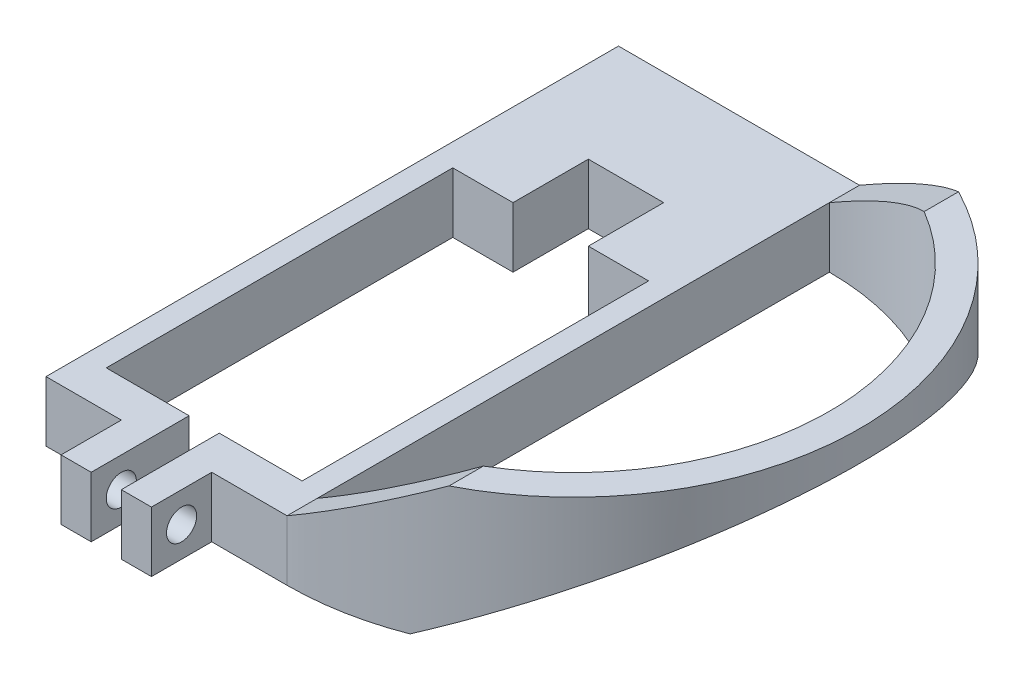
ISO-10303-21;
HEADER;
FILE_DESCRIPTION(('STEP AP214'),'2;1');
FILE_NAME('part.step','',(''),(''),'','','');
FILE_SCHEMA(('AUTOMOTIVE_DESIGN { 1 0 10303 214 1 1 1 1 }'));
ENDSEC;
DATA;
#1=APPLICATION_CONTEXT('core data for automotive mechanical design processes');
#2=APPLICATION_PROTOCOL_DEFINITION('international standard','automotive_design',2000,#1);
#3=PRODUCT_CONTEXT('',#1,'mechanical');
#4=PRODUCT('Part','Part','',(#3));
#5=PRODUCT_RELATED_PRODUCT_CATEGORY('part','',(#4));
#6=PRODUCT_DEFINITION_FORMATION('','',#4);
#7=PRODUCT_DEFINITION_CONTEXT('part definition',#1,'design');
#8=PRODUCT_DEFINITION('design','',#6,#7);
#9=PRODUCT_DEFINITION_SHAPE('','',#8);
#10=(LENGTH_UNIT() NAMED_UNIT(*) SI_UNIT(.MILLI.,.METRE.));
#11=(NAMED_UNIT(*) PLANE_ANGLE_UNIT() SI_UNIT($,.RADIAN.));
#12=(NAMED_UNIT(*) SI_UNIT($,.STERADIAN.) SOLID_ANGLE_UNIT());
#13=UNCERTAINTY_MEASURE_WITH_UNIT(LENGTH_MEASURE(1.E-05),#10,'distance_accuracy_value','');
#14=(GEOMETRIC_REPRESENTATION_CONTEXT(3) GLOBAL_UNCERTAINTY_ASSIGNED_CONTEXT((#13)) GLOBAL_UNIT_ASSIGNED_CONTEXT((#10,
#11,#12)) REPRESENTATION_CONTEXT('',''));
#15=CARTESIAN_POINT('',(0.,0.,0.));
#16=DIRECTION('',(0.,0.,1.));
#17=DIRECTION('',(1.,0.,0.));
#18=AXIS2_PLACEMENT_3D('',#15,#16,#17);
#19=CARTESIAN_POINT('',(1.,-0.00100000000000013,16.5));
#20=DIRECTION('',(1.,0.,0.));
#21=DIRECTION('',(0.,0.,-1.));
#22=AXIS2_PLACEMENT_3D('',#19,#20,#21);
#23=PLANE('',#22);
#24=DIRECTION('',(0.,0.,-1.));
#25=VECTOR('',#24,1.);
#26=CARTESIAN_POINT('',(1.,0.,16.5));
#27=LINE('',#26,#25);
#28=CARTESIAN_POINT('',(1.,0.,23.));
#29=VERTEX_POINT('',#28);
#30=CARTESIAN_POINT('',(0.999999999999998,0.,16.5));
#31=VERTEX_POINT('',#30);
#32=EDGE_CURVE('E384',#29,#31,#27,.T.);
#33=ORIENTED_EDGE('',*,*,#32,.F.);
#34=DIRECTION('',(0.,-1.,0.));
#35=VECTOR('',#34,1.);
#36=CARTESIAN_POINT('',(1.,8.47213595499958,23.));
#37=LINE('',#36,#35);
#38=CARTESIAN_POINT('',(1.,4.,23.));
#39=VERTEX_POINT('',#38);
#40=EDGE_CURVE('E758',#39,#29,#37,.T.);
#41=ORIENTED_EDGE('',*,*,#40,.F.);
#42=DIRECTION('',(0.,0.,-1.));
#43=VECTOR('',#42,1.);
#44=CARTESIAN_POINT('',(1.,4.,16.5));
#45=LINE('',#44,#43);
#46=CARTESIAN_POINT('',(0.999999999999998,4.,16.5));
#47=VERTEX_POINT('',#46);
#48=EDGE_CURVE('E391',#39,#47,#45,.T.);
#49=ORIENTED_EDGE('',*,*,#48,.T.);
#50=DIRECTION('',(0.,1.,0.));
#51=VECTOR('',#50,1.);
#52=CARTESIAN_POINT('',(1.,-0.00100000000000013,16.5));
#53=LINE('',#52,#51);
#54=EDGE_CURVE('E393',#31,#47,#53,.T.);
#55=ORIENTED_EDGE('',*,*,#54,.F.);
#56=EDGE_LOOP('',(#33,#41,#49,#55));
#57=FACE_BOUND('',#56,.T.);
#58=CARTESIAN_POINT('',(1.,2.,21.));
#59=DIRECTION('',(1.,0.,0.));
#60=DIRECTION('',(0.,0.,-1.));
#61=AXIS2_PLACEMENT_3D('',#58,#59,#60);
#62=CIRCLE('',#61,1.);
#63=CARTESIAN_POINT('',(1.,2.,20.));
#64=VERTEX_POINT('',#63);
#65=EDGE_CURVE('E778',#64,#64,#62,.T.);
#66=ORIENTED_EDGE('',*,*,#65,.T.);
#67=EDGE_LOOP('',(#66));
#68=FACE_BOUND('',#67,.T.);
#69=ADVANCED_FACE('F35',(#57,#68),#23,.F.);
#70=CARTESIAN_POINT('',(3.,8.47213595499958,19.));
#71=DIRECTION('',(-1.,0.,0.));
#72=DIRECTION('',(0.,0.,1.));
#73=AXIS2_PLACEMENT_3D('',#70,#71,#72);
#74=PLANE('',#73);
#75=DIRECTION('',(0.,-1.,0.));
#76=VECTOR('',#75,1.);
#77=CARTESIAN_POINT('',(3.,8.47213595499958,19.));
#78=LINE('',#77,#76);
#79=CARTESIAN_POINT('',(3.,4.,19.));
#80=VERTEX_POINT('',#79);
#81=CARTESIAN_POINT('',(3.,0.,19.));
#82=VERTEX_POINT('',#81);
#83=EDGE_CURVE('E212',#80,#82,#78,.T.);
#84=ORIENTED_EDGE('',*,*,#83,.F.);
#85=DIRECTION('',(0.,0.,1.));
#86=VECTOR('',#85,1.);
#87=CARTESIAN_POINT('',(3.,4.,19.));
#88=LINE('',#87,#86);
#89=CARTESIAN_POINT('',(3.,4.,23.));
#90=VERTEX_POINT('',#89);
#91=EDGE_CURVE('E759',#80,#90,#88,.T.);
#92=ORIENTED_EDGE('',*,*,#91,.T.);
#93=DIRECTION('',(0.,-1.,0.));
#94=VECTOR('',#93,1.);
#95=CARTESIAN_POINT('',(3.,8.47213595499958,23.));
#96=LINE('',#95,#94);
#97=CARTESIAN_POINT('',(3.,0.,23.));
#98=VERTEX_POINT('',#97);
#99=EDGE_CURVE('E215',#90,#98,#96,.T.);
#100=ORIENTED_EDGE('',*,*,#99,.T.);
#101=DIRECTION('',(0.,0.,-1.));
#102=VECTOR('',#101,1.);
#103=CARTESIAN_POINT('',(3.,0.,19.));
#104=LINE('',#103,#102);
#105=EDGE_CURVE('E207',#98,#82,#104,.T.);
#106=ORIENTED_EDGE('',*,*,#105,.T.);
#107=EDGE_LOOP('',(#84,#92,#100,#106));
#108=FACE_BOUND('',#107,.T.);
#109=CARTESIAN_POINT('',(3.,2.,21.));
#110=DIRECTION('',(-1.,0.,0.));
#111=DIRECTION('',(0.,0.,1.));
#112=AXIS2_PLACEMENT_3D('',#109,#110,#111);
#113=CIRCLE('',#112,1.);
#114=CARTESIAN_POINT('',(3.,2.,22.));
#115=VERTEX_POINT('',#114);
#116=EDGE_CURVE('E221',#115,#115,#113,.T.);
#117=ORIENTED_EDGE('',*,*,#116,.T.);
#118=EDGE_LOOP('',(#117));
#119=FACE_BOUND('',#118,.T.);
#120=ADVANCED_FACE('F209',(#108,#119),#74,.F.);
#121=CARTESIAN_POINT('',(-8.,4.,19.));
#122=DIRECTION('',(0.,0.,-1.));
#123=DIRECTION('',(-1.,0.,0.));
#124=AXIS2_PLACEMENT_3D('',#121,#122,#123);
#125=PLANE('',#124);
#126=ORIENTED_EDGE('',*,*,#83,.T.);
#127=DIRECTION('',(1.,0.,0.));
#128=VECTOR('',#127,1.);
#129=CARTESIAN_POINT('',(-8.,0.,19.));
#130=LINE('',#129,#128);
#131=CARTESIAN_POINT('',(8.,0.,19.));
#132=VERTEX_POINT('',#131);
#133=EDGE_CURVE('E226',#82,#132,#130,.T.);
#134=ORIENTED_EDGE('',*,*,#133,.T.);
#135=DIRECTION('',(0.,-1.,0.));
#136=VECTOR('',#135,1.);
#137=CARTESIAN_POINT('',(8.,4.,19.));
#138=LINE('',#137,#136);
#139=CARTESIAN_POINT('',(8.,4.,19.));
#140=VERTEX_POINT('',#139);
#141=EDGE_CURVE('E242',#140,#132,#138,.T.);
#142=ORIENTED_EDGE('',*,*,#141,.F.);
#143=DIRECTION('',(1.,0.,0.));
#144=VECTOR('',#143,1.);
#145=CARTESIAN_POINT('',(-8.,4.,19.));
#146=LINE('',#145,#144);
#147=EDGE_CURVE('E228',#80,#140,#146,.T.);
#148=ORIENTED_EDGE('',*,*,#147,.F.);
#149=EDGE_LOOP('',(#126,#134,#142,#148));
#150=FACE_BOUND('',#149,.T.);
#151=ADVANCED_FACE('F224',(#150),#125,.F.);
#152=CARTESIAN_POINT('',(-8.,0.,19.));
#153=VERTEX_POINT('',#152);
#154=CARTESIAN_POINT('',(-3.,0.,19.));
#155=VERTEX_POINT('',#154);
#156=EDGE_CURVE('E55',#153,#155,#130,.T.);
#157=ORIENTED_EDGE('',*,*,#156,.T.);
#158=DIRECTION('',(0.,-1.,0.));
#159=VECTOR('',#158,1.);
#160=CARTESIAN_POINT('',(-3.,8.47213595499958,19.));
#161=LINE('',#160,#159);
#162=CARTESIAN_POINT('',(-3.,4.,19.));
#163=VERTEX_POINT('',#162);
#164=EDGE_CURVE('E50',#163,#155,#161,.T.);
#165=ORIENTED_EDGE('',*,*,#164,.F.);
#166=CARTESIAN_POINT('',(-8.,4.,19.));
#167=VERTEX_POINT('',#166);
#168=EDGE_CURVE('E245',#167,#163,#146,.T.);
#169=ORIENTED_EDGE('',*,*,#168,.F.);
#170=DIRECTION('',(0.,-1.,0.));
#171=VECTOR('',#170,1.);
#172=CARTESIAN_POINT('',(-8.,4.,19.));
#173=LINE('',#172,#171);
#174=EDGE_CURVE('E244',#167,#153,#173,.T.);
#175=ORIENTED_EDGE('',*,*,#174,.T.);
#176=EDGE_LOOP('',(#157,#165,#169,#175));
#177=FACE_BOUND('',#176,.T.);
#178=ADVANCED_FACE('F509',(#177),#125,.F.);
#179=CARTESIAN_POINT('',(-6.5,4.,16.5));
#180=DIRECTION('',(0.,0.,-1.));
#181=DIRECTION('',(-1.,0.,0.));
#182=AXIS2_PLACEMENT_3D('',#179,#180,#181);
#183=PLANE('',#182);
#184=DIRECTION('',(0.,1.,0.));
#185=VECTOR('',#184,1.);
#186=CARTESIAN_POINT('',(-1.,-0.00100000000000013,16.5));
#187=LINE('',#186,#185);
#188=CARTESIAN_POINT('',(-1.,0.,16.5));
#189=VERTEX_POINT('',#188);
#190=CARTESIAN_POINT('',(-1.,4.,16.5));
#191=VERTEX_POINT('',#190);
#192=EDGE_CURVE('E394',#189,#191,#187,.T.);
#193=ORIENTED_EDGE('',*,*,#192,.F.);
#194=DIRECTION('',(1.,0.,0.));
#195=VECTOR('',#194,1.);
#196=CARTESIAN_POINT('',(-6.5,0.,16.5));
#197=LINE('',#196,#195);
#198=CARTESIAN_POINT('',(-6.5,0.,16.5));
#199=VERTEX_POINT('',#198);
#200=EDGE_CURVE('E310',#199,#189,#197,.T.);
#201=ORIENTED_EDGE('',*,*,#200,.F.);
#202=DIRECTION('',(0.,-1.,0.));
#203=VECTOR('',#202,1.);
#204=CARTESIAN_POINT('',(-6.5,4.,16.5));
#205=LINE('',#204,#203);
#206=CARTESIAN_POINT('',(-6.5,4.,16.5));
#207=VERTEX_POINT('',#206);
#208=EDGE_CURVE('E336',#207,#199,#205,.T.);
#209=ORIENTED_EDGE('',*,*,#208,.F.);
#210=DIRECTION('',(1.,0.,0.));
#211=VECTOR('',#210,1.);
#212=CARTESIAN_POINT('',(-6.5,4.,16.5));
#213=LINE('',#212,#211);
#214=EDGE_CURVE('E318',#207,#191,#213,.T.);
#215=ORIENTED_EDGE('',*,*,#214,.T.);
#216=EDGE_LOOP('',(#193,#201,#209,#215));
#217=FACE_BOUND('',#216,.T.);
#218=ADVANCED_FACE('F492',(#217),#183,.T.);
#219=CARTESIAN_POINT('',(-6.5,4.,-6.5));
#220=DIRECTION('',(0.,0.,1.));
#221=DIRECTION('',(1.,0.,0.));
#222=AXIS2_PLACEMENT_3D('',#219,#220,#221);
#223=PLANE('',#222);
#224=DIRECTION('',(0.,1.,0.));
#225=VECTOR('',#224,1.);
#226=CARTESIAN_POINT('',(-2.5,-0.00100000000000013,-6.5));
#227=LINE('',#226,#225);
#228=CARTESIAN_POINT('',(-2.5,0.,-6.5));
#229=VERTEX_POINT('',#228);
#230=CARTESIAN_POINT('',(-2.5,4.,-6.5));
#231=VERTEX_POINT('',#230);
#232=EDGE_CURVE('E415',#229,#231,#227,.T.);
#233=ORIENTED_EDGE('',*,*,#232,.T.);
#234=DIRECTION('',(-1.,0.,0.));
#235=VECTOR('',#234,1.);
#236=CARTESIAN_POINT('',(-6.5,4.,-6.5));
#237=LINE('',#236,#235);
#238=CARTESIAN_POINT('',(-6.5,4.,-6.5));
#239=VERTEX_POINT('',#238);
#240=EDGE_CURVE('E309',#231,#239,#237,.T.);
#241=ORIENTED_EDGE('',*,*,#240,.T.);
#242=DIRECTION('',(0.,-1.,0.));
#243=VECTOR('',#242,1.);
#244=CARTESIAN_POINT('',(-6.5,4.,-6.5));
#245=LINE('',#244,#243);
#246=CARTESIAN_POINT('',(-6.5,0.,-6.5));
#247=VERTEX_POINT('',#246);
#248=EDGE_CURVE('E338',#239,#247,#245,.T.);
#249=ORIENTED_EDGE('',*,*,#248,.T.);
#250=DIRECTION('',(-1.,0.,0.));
#251=VECTOR('',#250,1.);
#252=CARTESIAN_POINT('',(-6.5,0.,-6.5));
#253=LINE('',#252,#251);
#254=EDGE_CURVE('E324',#229,#247,#253,.T.);
#255=ORIENTED_EDGE('',*,*,#254,.F.);
#256=EDGE_LOOP('',(#233,#241,#249,#255));
#257=FACE_BOUND('',#256,.T.);
#258=ADVANCED_FACE('F501',(#257),#223,.T.);
#259=CARTESIAN_POINT('',(8.,4.,0.));
#260=DIRECTION('',(0.,-1.,0.));
#261=DIRECTION('',(0.,0.,-1.));
#262=AXIS2_PLACEMENT_3D('',#259,#260,#261);
#263=PLANE('',#262);
#264=ORIENTED_EDGE('',*,*,#168,.T.);
#265=DIRECTION('',(0.,0.,1.));
#266=VECTOR('',#265,1.);
#267=CARTESIAN_POINT('',(-3.,4.,19.));
#268=LINE('',#267,#266);
#269=CARTESIAN_POINT('',(-3.,4.,23.));
#270=VERTEX_POINT('',#269);
#271=EDGE_CURVE('E379',#163,#270,#268,.T.);
#272=ORIENTED_EDGE('',*,*,#271,.T.);
#273=DIRECTION('',(1.,0.,0.));
#274=VECTOR('',#273,1.);
#275=CARTESIAN_POINT('',(-1.,4.,23.));
#276=LINE('',#275,#274);
#277=CARTESIAN_POINT('',(-1.,4.,23.));
#278=VERTEX_POINT('',#277);
#279=EDGE_CURVE('E381',#270,#278,#276,.T.);
#280=ORIENTED_EDGE('',*,*,#279,.T.);
#281=DIRECTION('',(0.,0.,1.));
#282=VECTOR('',#281,1.);
#283=CARTESIAN_POINT('',(-1.,4.,16.5));
#284=LINE('',#283,#282);
#285=EDGE_CURVE('E389',#191,#278,#284,.T.);
#286=ORIENTED_EDGE('',*,*,#285,.F.);
#287=ORIENTED_EDGE('',*,*,#214,.F.);
#288=DIRECTION('',(0.,0.,1.));
#289=VECTOR('',#288,1.);
#290=CARTESIAN_POINT('',(-6.5,4.,16.5));
#291=LINE('',#290,#289);
#292=EDGE_CURVE('E314',#239,#207,#291,.T.);
#293=ORIENTED_EDGE('',*,*,#292,.F.);
#294=ORIENTED_EDGE('',*,*,#240,.F.);
#295=DIRECTION('',(0.,0.,1.));
#296=VECTOR('',#295,1.);
#297=CARTESIAN_POINT('',(-2.5,4.,-6.5));
#298=LINE('',#297,#296);
#299=CARTESIAN_POINT('',(-2.5,4.,-11.5));
#300=VERTEX_POINT('',#299);
#301=EDGE_CURVE('E407',#300,#231,#298,.T.);
#302=ORIENTED_EDGE('',*,*,#301,.F.);
#303=DIRECTION('',(-1.,0.,0.));
#304=VECTOR('',#303,1.);
#305=CARTESIAN_POINT('',(-2.5,4.,-11.5));
#306=LINE('',#305,#304);
#307=CARTESIAN_POINT('',(2.5,4.,-11.5));
#308=VERTEX_POINT('',#307);
#309=EDGE_CURVE('E412',#308,#300,#306,.T.);
#310=ORIENTED_EDGE('',*,*,#309,.F.);
#311=DIRECTION('',(0.,0.,-1.));
#312=VECTOR('',#311,1.);
#313=CARTESIAN_POINT('',(2.5,4.,-6.5));
#314=LINE('',#313,#312);
#315=CARTESIAN_POINT('',(2.5,4.,-6.5));
#316=VERTEX_POINT('',#315);
#317=EDGE_CURVE('E409',#316,#308,#314,.T.);
#318=ORIENTED_EDGE('',*,*,#317,.F.);
#319=CARTESIAN_POINT('',(6.5,4.,-6.5));
#320=VERTEX_POINT('',#319);
#321=EDGE_CURVE('E311',#320,#316,#237,.T.);
#322=ORIENTED_EDGE('',*,*,#321,.F.);
#323=DIRECTION('',(0.,0.,-1.));
#324=VECTOR('',#323,1.);
#325=CARTESIAN_POINT('',(6.5,4.,16.5));
#326=LINE('',#325,#324);
#327=CARTESIAN_POINT('',(6.5,4.,16.5));
#328=VERTEX_POINT('',#327);
#329=EDGE_CURVE('E307',#328,#320,#326,.T.);
#330=ORIENTED_EDGE('',*,*,#329,.F.);
#331=EDGE_CURVE('E317',#47,#328,#213,.T.);
#332=ORIENTED_EDGE('',*,*,#331,.F.);
#333=ORIENTED_EDGE('',*,*,#48,.F.);
#334=DIRECTION('',(-1.,0.,0.));
#335=VECTOR('',#334,1.);
#336=CARTESIAN_POINT('',(1.,4.,23.));
#337=LINE('',#336,#335);
#338=EDGE_CURVE('E756',#90,#39,#337,.T.);
#339=ORIENTED_EDGE('',*,*,#338,.F.);
#340=ORIENTED_EDGE('',*,*,#91,.F.);
#341=ORIENTED_EDGE('',*,*,#147,.T.);
#342=DIRECTION('',(0.,0.,1.));
#343=VECTOR('',#342,1.);
#344=CARTESIAN_POINT('',(8.,4.,17.));
#345=LINE('',#344,#343);
#346=CARTESIAN_POINT('',(8.,4.,17.));
#347=VERTEX_POINT('',#346);
#348=EDGE_CURVE('E287',#347,#140,#345,.T.);
#349=ORIENTED_EDGE('',*,*,#348,.F.);
#350=DIRECTION('',(0.,0.,1.));
#351=VECTOR('',#350,1.);
#352=CARTESIAN_POINT('',(7.99999999999999,4.,-17.));
#353=LINE('',#352,#351);
#354=CARTESIAN_POINT('',(8.,4.,-17.));
#355=VERTEX_POINT('',#354);
#356=EDGE_CURVE('E295',#355,#347,#353,.T.);
#357=ORIENTED_EDGE('',*,*,#356,.F.);
#358=DIRECTION('',(0.,0.,1.));
#359=VECTOR('',#358,1.);
#360=CARTESIAN_POINT('',(7.99999999999999,4.,-19.));
#361=LINE('',#360,#359);
#362=CARTESIAN_POINT('',(8.,4.,-19.));
#363=VERTEX_POINT('',#362);
#364=EDGE_CURVE('E291',#363,#355,#361,.T.);
#365=ORIENTED_EDGE('',*,*,#364,.F.);
#366=DIRECTION('',(-1.,0.,0.));
#367=VECTOR('',#366,1.);
#368=CARTESIAN_POINT('',(-8.00000000000001,4.,-19.));
#369=LINE('',#368,#367);
#370=CARTESIAN_POINT('',(-8.00000000000001,4.,-19.));
#371=VERTEX_POINT('',#370);
#372=EDGE_CURVE('E237',#363,#371,#369,.T.);
#373=ORIENTED_EDGE('',*,*,#372,.T.);
#374=DIRECTION('',(0.,0.,1.));
#375=VECTOR('',#374,1.);
#376=CARTESIAN_POINT('',(-8.,4.,19.));
#377=LINE('',#376,#375);
#378=EDGE_CURVE('E346',#371,#167,#377,.T.);
#379=ORIENTED_EDGE('',*,*,#378,.T.);
#380=EDGE_LOOP('',(#264,#272,#280,#286,#287,#293,#294,#302,#310,#318,#322,#330,#332,#333,#339,
#340,#341,#349,#357,#365,#373,#379));
#381=FACE_BOUND('',#380,.T.);
#382=ADVANCED_FACE('F434',(#381),#263,.F.);
#383=CARTESIAN_POINT('',(8.,0.,0.));
#384=DIRECTION('',(0.,-1.,0.));
#385=DIRECTION('',(0.,0.,-1.));
#386=AXIS2_PLACEMENT_3D('',#383,#384,#385);
#387=PLANE('',#386);
#388=DIRECTION('',(0.,0.,1.));
#389=VECTOR('',#388,1.);
#390=CARTESIAN_POINT('',(-1.,0.,16.5));
#391=LINE('',#390,#389);
#392=CARTESIAN_POINT('',(-1.,0.,23.));
#393=VERTEX_POINT('',#392);
#394=EDGE_CURVE('E387',#189,#393,#391,.T.);
#395=ORIENTED_EDGE('',*,*,#394,.T.);
#396=DIRECTION('',(-1.,0.,0.));
#397=VECTOR('',#396,1.);
#398=CARTESIAN_POINT('',(-1.,0.,23.));
#399=LINE('',#398,#397);
#400=CARTESIAN_POINT('',(-3.,0.,23.));
#401=VERTEX_POINT('',#400);
#402=EDGE_CURVE('E366',#393,#401,#399,.T.);
#403=ORIENTED_EDGE('',*,*,#402,.T.);
#404=DIRECTION('',(0.,0.,-1.));
#405=VECTOR('',#404,1.);
#406=CARTESIAN_POINT('',(-3.,0.,19.));
#407=LINE('',#406,#405);
#408=EDGE_CURVE('E364',#401,#155,#407,.T.);
#409=ORIENTED_EDGE('',*,*,#408,.T.);
#410=ORIENTED_EDGE('',*,*,#156,.F.);
#411=DIRECTION('',(0.,0.,1.));
#412=VECTOR('',#411,1.);
#413=CARTESIAN_POINT('',(-8.,0.,19.));
#414=LINE('',#413,#412);
#415=CARTESIAN_POINT('',(-8.00000000000001,0.,-19.));
#416=VERTEX_POINT('',#415);
#417=EDGE_CURVE('E235',#416,#153,#414,.T.);
#418=ORIENTED_EDGE('',*,*,#417,.F.);
#419=DIRECTION('',(-1.,0.,0.));
#420=VECTOR('',#419,1.);
#421=CARTESIAN_POINT('',(-8.00000000000001,0.,-19.));
#422=LINE('',#421,#420);
#423=CARTESIAN_POINT('',(7.99999999999999,0.,-19.));
#424=VERTEX_POINT('',#423);
#425=EDGE_CURVE('E238',#424,#416,#422,.T.);
#426=ORIENTED_EDGE('',*,*,#425,.F.);
#427=CARTESIAN_POINT('',(8.,0.,0.));
#428=DIRECTION('',(0.,1.,0.));
#429=DIRECTION('',(0.,0.,-1.));
#430=AXIS2_PLACEMENT_3D('',#427,#428,#429);
#431=CIRCLE('',#430,19.);
#432=CARTESIAN_POINT('',(14.8756443470177,0.,-17.7122984057215));
#433=VERTEX_POINT('',#432);
#434=EDGE_CURVE('E344',#433,#424,#431,.T.);
#435=ORIENTED_EDGE('',*,*,#434,.F.);
#436=DIRECTION('',(0.,0.,1.));
#437=VECTOR('',#436,1.);
#438=CARTESIAN_POINT('',(14.8756443470177,0.,-33.0000000000001));
#439=LINE('',#438,#437);
#440=CARTESIAN_POINT('',(14.8756443470177,0.,-15.5475243950065));
#441=VERTEX_POINT('',#440);
#442=EDGE_CURVE('E426',#433,#441,#439,.T.);
#443=ORIENTED_EDGE('',*,*,#442,.T.);
#444=CARTESIAN_POINT('',(8.,0.,0.));
#445=DIRECTION('',(0.,1.,0.));
#446=DIRECTION('',(0.,0.,-1.));
#447=AXIS2_PLACEMENT_3D('',#444,#445,#446);
#448=CIRCLE('',#447,17.);
#449=CARTESIAN_POINT('',(7.99999999999999,0.,-17.));
#450=VERTEX_POINT('',#449);
#451=EDGE_CURVE('E282',#441,#450,#448,.T.);
#452=ORIENTED_EDGE('',*,*,#451,.T.);
#453=DIRECTION('',(0.,0.,1.));
#454=VECTOR('',#453,1.);
#455=CARTESIAN_POINT('',(7.99999999999999,0.,-17.));
#456=LINE('',#455,#454);
#457=CARTESIAN_POINT('',(8.,0.,17.));
#458=VERTEX_POINT('',#457);
#459=EDGE_CURVE('E297',#450,#458,#456,.T.);
#460=ORIENTED_EDGE('',*,*,#459,.T.);
#461=CARTESIAN_POINT('',(14.8756443470177,0.,15.5475243950065));
#462=VERTEX_POINT('',#461);
#463=EDGE_CURVE('E285',#458,#462,#448,.T.);
#464=ORIENTED_EDGE('',*,*,#463,.T.);
#465=CARTESIAN_POINT('',(14.8756443470177,0.,17.7122984057215));
#466=VERTEX_POINT('',#465);
#467=EDGE_CURVE('E418',#462,#466,#439,.T.);
#468=ORIENTED_EDGE('',*,*,#467,.T.);
#469=EDGE_CURVE('E234',#132,#466,#431,.T.);
#470=ORIENTED_EDGE('',*,*,#469,.F.);
#471=ORIENTED_EDGE('',*,*,#133,.F.);
#472=ORIENTED_EDGE('',*,*,#105,.F.);
#473=DIRECTION('',(1.,0.,0.));
#474=VECTOR('',#473,1.);
#475=CARTESIAN_POINT('',(1.,0.,23.));
#476=LINE('',#475,#474);
#477=EDGE_CURVE('E220',#29,#98,#476,.T.);
#478=ORIENTED_EDGE('',*,*,#477,.F.);
#479=ORIENTED_EDGE('',*,*,#32,.T.);
#480=CARTESIAN_POINT('',(6.5,0.,16.5));
#481=VERTEX_POINT('',#480);
#482=EDGE_CURVE('E331',#31,#481,#197,.T.);
#483=ORIENTED_EDGE('',*,*,#482,.T.);
#484=DIRECTION('',(0.,0.,-1.));
#485=VECTOR('',#484,1.);
#486=CARTESIAN_POINT('',(6.5,0.,16.5));
#487=LINE('',#486,#485);
#488=CARTESIAN_POINT('',(6.5,0.,-6.5));
#489=VERTEX_POINT('',#488);
#490=EDGE_CURVE('E306',#481,#489,#487,.T.);
#491=ORIENTED_EDGE('',*,*,#490,.T.);
#492=CARTESIAN_POINT('',(2.5,0.,-6.5));
#493=VERTEX_POINT('',#492);
#494=EDGE_CURVE('E325',#489,#493,#253,.T.);
#495=ORIENTED_EDGE('',*,*,#494,.T.);
#496=DIRECTION('',(0.,0.,-1.));
#497=VECTOR('',#496,1.);
#498=CARTESIAN_POINT('',(2.5,0.,-6.5));
#499=LINE('',#498,#497);
#500=CARTESIAN_POINT('',(2.5,0.,-11.5));
#501=VERTEX_POINT('',#500);
#502=EDGE_CURVE('E396',#493,#501,#499,.T.);
#503=ORIENTED_EDGE('',*,*,#502,.T.);
#504=DIRECTION('',(-1.,0.,0.));
#505=VECTOR('',#504,1.);
#506=CARTESIAN_POINT('',(-2.5,0.,-11.5));
#507=LINE('',#506,#505);
#508=CARTESIAN_POINT('',(-2.5,0.,-11.5));
#509=VERTEX_POINT('',#508);
#510=EDGE_CURVE('E401',#501,#509,#507,.T.);
#511=ORIENTED_EDGE('',*,*,#510,.T.);
#512=DIRECTION('',(0.,0.,1.));
#513=VECTOR('',#512,1.);
#514=CARTESIAN_POINT('',(-2.5,0.,-6.5));
#515=LINE('',#514,#513);
#516=EDGE_CURVE('E404',#509,#229,#515,.T.);
#517=ORIENTED_EDGE('',*,*,#516,.T.);
#518=ORIENTED_EDGE('',*,*,#254,.T.);
#519=DIRECTION('',(0.,0.,1.));
#520=VECTOR('',#519,1.);
#521=CARTESIAN_POINT('',(-6.5,0.,16.5));
#522=LINE('',#521,#520);
#523=EDGE_CURVE('E328',#247,#199,#522,.T.);
#524=ORIENTED_EDGE('',*,*,#523,.T.);
#525=ORIENTED_EDGE('',*,*,#200,.T.);
#526=EDGE_LOOP('',(#395,#403,#409,#410,#418,#426,#435,#443,#452,#460,#464,#468,#470,#471,#472,
#478,#479,#483,#491,#495,#503,#511,#517,#518,#524,#525));
#527=FACE_BOUND('',#526,.T.);
#528=ADVANCED_FACE('F231',(#527),#387,.T.);
#529=CARTESIAN_POINT('',(8.,4.,0.));
#530=DIRECTION('',(0.,-1.,0.));
#531=DIRECTION('',(0.,0.,-1.));
#532=AXIS2_PLACEMENT_3D('',#529,#530,#531);
#533=CYLINDRICAL_SURFACE('',#532,19.);
#534=ORIENTED_EDGE('',*,*,#469,.T.);
#535=CARTESIAN_POINT('',(8.,-3.96965511460274,0.));
#536=DIRECTION('',(-0.499999999999995,0.866025403784442,0.));
#537=DIRECTION('',(-0.866025403784442,-0.499999999999995,0.));
#538=AXIS2_PLACEMENT_3D('',#535,#536,#537);
#539=ELLIPSE('',#538,21.9393102292057,19.);
#540=EDGE_CURVE('E279',#466,#433,#539,.T.);
#541=ORIENTED_EDGE('',*,*,#540,.T.);
#542=ORIENTED_EDGE('',*,*,#434,.T.);
#543=DIRECTION('',(0.,-1.,0.));
#544=VECTOR('',#543,1.);
#545=CARTESIAN_POINT('',(7.99999999999999,4.,-19.));
#546=LINE('',#545,#544);
#547=EDGE_CURVE('E250',#363,#424,#546,.T.);
#548=ORIENTED_EDGE('',*,*,#547,.F.);
#549=CARTESIAN_POINT('',(8.,4.,0.));
#550=DIRECTION('',(0.499999999999995,-0.866025403784441,0.));
#551=DIRECTION('',(-0.866025403784442,-0.499999999999995,0.));
#552=AXIS2_PLACEMENT_3D('',#549,#550,#551);
#553=ELLIPSE('',#552,21.9393102292057,19.);
#554=CARTESIAN_POINT('',(16.6602540378445,9.,-16.9115345252877));
#555=VERTEX_POINT('',#554);
#556=EDGE_CURVE('E293',#363,#555,#553,.T.);
#557=ORIENTED_EDGE('',*,*,#556,.T.);
#558=CARTESIAN_POINT('',(8.,9.,0.));
#559=DIRECTION('',(0.,1.,0.));
#560=DIRECTION('',(0.,0.,1.));
#561=AXIS2_PLACEMENT_3D('',#558,#559,#560);
#562=CIRCLE('',#561,19.);
#563=CARTESIAN_POINT('',(16.6602540378445,9.,16.9115345252877));
#564=VERTEX_POINT('',#563);
#565=EDGE_CURVE('E283',#564,#555,#562,.T.);
#566=ORIENTED_EDGE('',*,*,#565,.F.);
#567=EDGE_CURVE('E264',#564,#140,#553,.T.);
#568=ORIENTED_EDGE('',*,*,#567,.T.);
#569=ORIENTED_EDGE('',*,*,#141,.T.);
#570=EDGE_LOOP('',(#534,#541,#542,#548,#557,#566,#568,#569));
#571=FACE_BOUND('',#570,.T.);
#572=ADVANCED_FACE('F37',(#571),#533,.T.);
#573=CARTESIAN_POINT('',(-8.00000000000001,4.,-19.));
#574=DIRECTION('',(0.,0.,1.));
#575=DIRECTION('',(1.,0.,0.));
#576=AXIS2_PLACEMENT_3D('',#573,#574,#575);
#577=PLANE('',#576);
#578=ORIENTED_EDGE('',*,*,#425,.T.);
#579=DIRECTION('',(0.,-1.,0.));
#580=VECTOR('',#579,1.);
#581=CARTESIAN_POINT('',(-8.00000000000001,4.,-19.));
#582=LINE('',#581,#580);
#583=EDGE_CURVE('E247',#371,#416,#582,.T.);
#584=ORIENTED_EDGE('',*,*,#583,.F.);
#585=ORIENTED_EDGE('',*,*,#372,.F.);
#586=ORIENTED_EDGE('',*,*,#547,.T.);
#587=EDGE_LOOP('',(#578,#584,#585,#586));
#588=FACE_BOUND('',#587,.T.);
#589=ADVANCED_FACE('F352',(#588),#577,.F.);
#590=CARTESIAN_POINT('',(-8.,4.,19.));
#591=DIRECTION('',(1.,0.,0.));
#592=DIRECTION('',(0.,0.,-1.));
#593=AXIS2_PLACEMENT_3D('',#590,#591,#592);
#594=PLANE('',#593);
#595=ORIENTED_EDGE('',*,*,#417,.T.);
#596=ORIENTED_EDGE('',*,*,#174,.F.);
#597=ORIENTED_EDGE('',*,*,#378,.F.);
#598=ORIENTED_EDGE('',*,*,#583,.T.);
#599=EDGE_LOOP('',(#595,#596,#597,#598));
#600=FACE_BOUND('',#599,.T.);
#601=ADVANCED_FACE('F359',(#600),#594,.F.);
#602=CARTESIAN_POINT('',(6.5,4.,16.5));
#603=DIRECTION('',(-1.,0.,0.));
#604=DIRECTION('',(0.,0.,1.));
#605=AXIS2_PLACEMENT_3D('',#602,#603,#604);
#606=PLANE('',#605);
#607=ORIENTED_EDGE('',*,*,#490,.F.);
#608=DIRECTION('',(0.,-1.,0.));
#609=VECTOR('',#608,1.);
#610=CARTESIAN_POINT('',(6.5,4.,16.5));
#611=LINE('',#610,#609);
#612=EDGE_CURVE('E321',#328,#481,#611,.T.);
#613=ORIENTED_EDGE('',*,*,#612,.F.);
#614=ORIENTED_EDGE('',*,*,#329,.T.);
#615=DIRECTION('',(0.,-1.,0.));
#616=VECTOR('',#615,1.);
#617=CARTESIAN_POINT('',(6.5,4.,-6.5));
#618=LINE('',#617,#616);
#619=EDGE_CURVE('E341',#320,#489,#618,.T.);
#620=ORIENTED_EDGE('',*,*,#619,.T.);
#621=EDGE_LOOP('',(#607,#613,#614,#620));
#622=FACE_BOUND('',#621,.T.);
#623=ADVANCED_FACE('F499',(#622),#606,.T.);
#624=DIRECTION('',(0.,1.,0.));
#625=VECTOR('',#624,1.);
#626=CARTESIAN_POINT('',(2.5,-0.00100000000000013,-6.5));
#627=LINE('',#626,#625);
#628=EDGE_CURVE('E421',#493,#316,#627,.T.);
#629=ORIENTED_EDGE('',*,*,#628,.F.);
#630=ORIENTED_EDGE('',*,*,#494,.F.);
#631=ORIENTED_EDGE('',*,*,#619,.F.);
#632=ORIENTED_EDGE('',*,*,#321,.T.);
#633=EDGE_LOOP('',(#629,#630,#631,#632));
#634=FACE_BOUND('',#633,.T.);
#635=ADVANCED_FACE('F495',(#634),#223,.T.);
#636=CARTESIAN_POINT('',(-6.5,4.,16.5));
#637=DIRECTION('',(1.,0.,0.));
#638=DIRECTION('',(0.,0.,-1.));
#639=AXIS2_PLACEMENT_3D('',#636,#637,#638);
#640=PLANE('',#639);
#641=ORIENTED_EDGE('',*,*,#523,.F.);
#642=ORIENTED_EDGE('',*,*,#248,.F.);
#643=ORIENTED_EDGE('',*,*,#292,.T.);
#644=ORIENTED_EDGE('',*,*,#208,.T.);
#645=EDGE_LOOP('',(#641,#642,#643,#644));
#646=FACE_BOUND('',#645,.T.);
#647=ADVANCED_FACE('F490',(#646),#640,.T.);
#648=ORIENTED_EDGE('',*,*,#54,.T.);
#649=ORIENTED_EDGE('',*,*,#331,.T.);
#650=ORIENTED_EDGE('',*,*,#612,.T.);
#651=ORIENTED_EDGE('',*,*,#482,.F.);
#652=EDGE_LOOP('',(#648,#649,#650,#651));
#653=FACE_BOUND('',#652,.T.);
#654=ADVANCED_FACE('F487',(#653),#183,.T.);
#655=CARTESIAN_POINT('',(8.,4.,0.));
#656=DIRECTION('',(0.,-1.,0.));
#657=DIRECTION('',(0.,0.,-1.));
#658=AXIS2_PLACEMENT_3D('',#655,#656,#657);
#659=CYLINDRICAL_SURFACE('',#658,17.);
#660=CARTESIAN_POINT('',(8.,-3.96965511460274,0.));
#661=DIRECTION('',(-0.499999999999995,0.866025403784442,0.));
#662=DIRECTION('',(-0.866025403784442,-0.499999999999995,0.));
#663=AXIS2_PLACEMENT_3D('',#660,#661,#662);
#664=ELLIPSE('',#663,19.6299091524472,17.);
#665=EDGE_CURVE('E11',#462,#441,#664,.T.);
#666=ORIENTED_EDGE('',*,*,#665,.F.);
#667=ORIENTED_EDGE('',*,*,#463,.F.);
#668=DIRECTION('',(0.,-1.,0.));
#669=VECTOR('',#668,1.);
#670=CARTESIAN_POINT('',(8.,4.,17.));
#671=LINE('',#670,#669);
#672=EDGE_CURVE('E277',#347,#458,#671,.T.);
#673=ORIENTED_EDGE('',*,*,#672,.F.);
#674=CARTESIAN_POINT('',(8.,4.,0.));
#675=DIRECTION('',(0.499999999999995,-0.866025403784441,0.));
#676=DIRECTION('',(-0.866025403784442,-0.499999999999995,0.));
#677=AXIS2_PLACEMENT_3D('',#674,#675,#676);
#678=ELLIPSE('',#677,19.6299091524472,17.);
#679=CARTESIAN_POINT('',(16.6602540378445,9.,14.6287388383277));
#680=VERTEX_POINT('',#679);
#681=EDGE_CURVE('E261',#680,#347,#678,.T.);
#682=ORIENTED_EDGE('',*,*,#681,.F.);
#683=CARTESIAN_POINT('',(8.,9.,0.));
#684=DIRECTION('',(0.,-1.,0.));
#685=DIRECTION('',(0.,0.,1.));
#686=AXIS2_PLACEMENT_3D('',#683,#684,#685);
#687=CIRCLE('',#686,17.);
#688=CARTESIAN_POINT('',(16.6602540378445,9.,-14.6287388383277));
#689=VERTEX_POINT('',#688);
#690=EDGE_CURVE('E275',#689,#680,#687,.T.);
#691=ORIENTED_EDGE('',*,*,#690,.F.);
#692=EDGE_CURVE('E278',#355,#689,#678,.T.);
#693=ORIENTED_EDGE('',*,*,#692,.F.);
#694=DIRECTION('',(0.,-1.,0.));
#695=VECTOR('',#694,1.);
#696=CARTESIAN_POINT('',(7.99999999999999,4.,-17.));
#697=LINE('',#696,#695);
#698=EDGE_CURVE('E303',#355,#450,#697,.T.);
#699=ORIENTED_EDGE('',*,*,#698,.T.);
#700=ORIENTED_EDGE('',*,*,#451,.F.);
#701=EDGE_LOOP('',(#666,#667,#673,#682,#691,#693,#699,#700));
#702=FACE_BOUND('',#701,.T.);
#703=ADVANCED_FACE('F273',(#702),#659,.F.);
#704=CARTESIAN_POINT('',(7.99999999999999,4.,-17.));
#705=DIRECTION('',(1.,0.,0.));
#706=DIRECTION('',(0.,0.,-1.));
#707=AXIS2_PLACEMENT_3D('',#704,#705,#706);
#708=PLANE('',#707);
#709=ORIENTED_EDGE('',*,*,#459,.F.);
#710=ORIENTED_EDGE('',*,*,#698,.F.);
#711=ORIENTED_EDGE('',*,*,#356,.T.);
#712=ORIENTED_EDGE('',*,*,#672,.T.);
#713=EDGE_LOOP('',(#709,#710,#711,#712));
#714=FACE_BOUND('',#713,.T.);
#715=ADVANCED_FACE('F437',(#714),#708,.T.);
#716=CARTESIAN_POINT('',(8.,9.,0.));
#717=DIRECTION('',(0.,1.,0.));
#718=DIRECTION('',(0.,0.,1.));
#719=AXIS2_PLACEMENT_3D('',#716,#717,#718);
#720=PLANE('',#719);
#721=DIRECTION('',(0.,0.,-1.));
#722=VECTOR('',#721,1.);
#723=CARTESIAN_POINT('',(16.6602540378445,9.,0.));
#724=LINE('',#723,#722);
#725=EDGE_CURVE('E43',#564,#680,#724,.T.);
#726=ORIENTED_EDGE('',*,*,#725,.F.);
#727=ORIENTED_EDGE('',*,*,#565,.T.);
#728=EDGE_CURVE('E252',#689,#555,#724,.T.);
#729=ORIENTED_EDGE('',*,*,#728,.F.);
#730=ORIENTED_EDGE('',*,*,#690,.T.);
#731=EDGE_LOOP('',(#726,#727,#729,#730));
#732=FACE_BOUND('',#731,.T.);
#733=ADVANCED_FACE('F281',(#732),#720,.T.);
#734=CARTESIAN_POINT('',(16.6602540378445,9.,-33.0000000000001));
#735=DIRECTION('',(0.499999999999995,-0.866025403784441,0.));
#736=DIRECTION('',(0.866025403784442,0.499999999999995,0.));
#737=AXIS2_PLACEMENT_3D('',#734,#735,#736);
#738=PLANE('',#737);
#739=ORIENTED_EDGE('',*,*,#364,.T.);
#740=ORIENTED_EDGE('',*,*,#692,.T.);
#741=ORIENTED_EDGE('',*,*,#728,.T.);
#742=ORIENTED_EDGE('',*,*,#556,.F.);
#743=EDGE_LOOP('',(#739,#740,#741,#742));
#744=FACE_BOUND('',#743,.T.);
#745=ADVANCED_FACE('F428',(#744),#738,.F.);
#746=ORIENTED_EDGE('',*,*,#725,.T.);
#747=ORIENTED_EDGE('',*,*,#681,.T.);
#748=ORIENTED_EDGE('',*,*,#348,.T.);
#749=ORIENTED_EDGE('',*,*,#567,.F.);
#750=EDGE_LOOP('',(#746,#747,#748,#749));
#751=FACE_BOUND('',#750,.T.);
#752=ADVANCED_FACE('F259',(#751),#738,.F.);
#753=CARTESIAN_POINT('',(27.,7.,-33.0000000000001));
#754=DIRECTION('',(-0.499999999999995,0.866025403784442,0.));
#755=DIRECTION('',(-0.866025403784442,-0.499999999999995,0.));
#756=AXIS2_PLACEMENT_3D('',#753,#754,#755);
#757=PLANE('',#756);
#758=ORIENTED_EDGE('',*,*,#467,.F.);
#759=ORIENTED_EDGE('',*,*,#665,.T.);
#760=ORIENTED_EDGE('',*,*,#442,.F.);
#761=ORIENTED_EDGE('',*,*,#540,.F.);
#762=EDGE_LOOP('',(#758,#759,#760,#761));
#763=FACE_BOUND('',#762,.T.);
#764=ADVANCED_FACE('F441',(#763),#757,.F.);
#765=CARTESIAN_POINT('',(-2.5,-0.00100000000000013,-6.5));
#766=DIRECTION('',(-1.,0.,0.));
#767=DIRECTION('',(0.,0.,1.));
#768=AXIS2_PLACEMENT_3D('',#765,#766,#767);
#769=PLANE('',#768);
#770=DIRECTION('',(0.,1.,0.));
#771=VECTOR('',#770,1.);
#772=CARTESIAN_POINT('',(-2.5,-0.00100000000000013,-11.5));
#773=LINE('',#772,#771);
#774=EDGE_CURVE('E416',#509,#300,#773,.T.);
#775=ORIENTED_EDGE('',*,*,#774,.T.);
#776=ORIENTED_EDGE('',*,*,#301,.T.);
#777=ORIENTED_EDGE('',*,*,#232,.F.);
#778=ORIENTED_EDGE('',*,*,#516,.F.);
#779=EDGE_LOOP('',(#775,#776,#777,#778));
#780=FACE_BOUND('',#779,.T.);
#781=ADVANCED_FACE('F469',(#780),#769,.F.);
#782=CARTESIAN_POINT('',(-2.5,-0.00100000000000013,-11.5));
#783=DIRECTION('',(0.,0.,-1.));
#784=DIRECTION('',(-1.,0.,0.));
#785=AXIS2_PLACEMENT_3D('',#782,#783,#784);
#786=PLANE('',#785);
#787=DIRECTION('',(0.,1.,0.));
#788=VECTOR('',#787,1.);
#789=CARTESIAN_POINT('',(2.5,-0.00100000000000013,-11.5));
#790=LINE('',#789,#788);
#791=EDGE_CURVE('E419',#501,#308,#790,.T.);
#792=ORIENTED_EDGE('',*,*,#791,.T.);
#793=ORIENTED_EDGE('',*,*,#309,.T.);
#794=ORIENTED_EDGE('',*,*,#774,.F.);
#795=ORIENTED_EDGE('',*,*,#510,.F.);
#796=EDGE_LOOP('',(#792,#793,#794,#795));
#797=FACE_BOUND('',#796,.T.);
#798=ADVANCED_FACE('F466',(#797),#786,.F.);
#799=CARTESIAN_POINT('',(2.5,-0.00100000000000013,-6.5));
#800=DIRECTION('',(1.,0.,0.));
#801=DIRECTION('',(0.,0.,-1.));
#802=AXIS2_PLACEMENT_3D('',#799,#800,#801);
#803=PLANE('',#802);
#804=ORIENTED_EDGE('',*,*,#628,.T.);
#805=ORIENTED_EDGE('',*,*,#317,.T.);
#806=ORIENTED_EDGE('',*,*,#791,.F.);
#807=ORIENTED_EDGE('',*,*,#502,.F.);
#808=EDGE_LOOP('',(#804,#805,#806,#807));
#809=FACE_BOUND('',#808,.T.);
#810=ADVANCED_FACE('F464',(#809),#803,.F.);
#811=CARTESIAN_POINT('',(-1.,-0.00100000000000013,16.5));
#812=DIRECTION('',(-1.,0.,0.));
#813=DIRECTION('',(0.,0.,1.));
#814=AXIS2_PLACEMENT_3D('',#811,#812,#813);
#815=PLANE('',#814);
#816=CARTESIAN_POINT('',(-1.,2.,21.));
#817=DIRECTION('',(-1.,0.,0.));
#818=DIRECTION('',(0.,0.,1.));
#819=AXIS2_PLACEMENT_3D('',#816,#817,#818);
#820=CIRCLE('',#819,1.);
#821=CARTESIAN_POINT('',(-0.999999999999997,2.,22.));
#822=VERTEX_POINT('',#821);
#823=EDGE_CURVE('E374',#822,#822,#820,.F.);
#824=ORIENTED_EDGE('',*,*,#823,.F.);
#825=EDGE_LOOP('',(#824));
#826=FACE_BOUND('',#825,.T.);
#827=ORIENTED_EDGE('',*,*,#192,.T.);
#828=ORIENTED_EDGE('',*,*,#285,.T.);
#829=DIRECTION('',(0.,-1.,0.));
#830=VECTOR('',#829,1.);
#831=CARTESIAN_POINT('',(-1.,8.47213595499958,23.));
#832=LINE('',#831,#830);
#833=EDGE_CURVE('E369',#278,#393,#832,.T.);
#834=ORIENTED_EDGE('',*,*,#833,.T.);
#835=ORIENTED_EDGE('',*,*,#394,.F.);
#836=EDGE_LOOP('',(#827,#828,#834,#835));
#837=FACE_BOUND('',#836,.T.);
#838=ADVANCED_FACE('F460',(#826,#837),#815,.F.);
#839=CARTESIAN_POINT('',(-3.,8.47213595499958,19.));
#840=DIRECTION('',(-1.,0.,0.));
#841=DIRECTION('',(0.,0.,1.));
#842=AXIS2_PLACEMENT_3D('',#839,#840,#841);
#843=PLANE('',#842);
#844=CARTESIAN_POINT('',(-3.,2.,21.));
#845=DIRECTION('',(-1.,0.,0.));
#846=DIRECTION('',(0.,0.,1.));
#847=AXIS2_PLACEMENT_3D('',#844,#845,#846);
#848=CIRCLE('',#847,1.);
#849=CARTESIAN_POINT('',(-3.,2.,22.));
#850=VERTEX_POINT('',#849);
#851=EDGE_CURVE('E761',#850,#850,#848,.T.);
#852=ORIENTED_EDGE('',*,*,#851,.F.);
#853=EDGE_LOOP('',(#852));
#854=FACE_BOUND('',#853,.T.);
#855=ORIENTED_EDGE('',*,*,#271,.F.);
#856=ORIENTED_EDGE('',*,*,#164,.T.);
#857=ORIENTED_EDGE('',*,*,#408,.F.);
#858=DIRECTION('',(0.,-1.,0.));
#859=VECTOR('',#858,1.);
#860=CARTESIAN_POINT('',(-3.,8.47213595499958,23.));
#861=LINE('',#860,#859);
#862=EDGE_CURVE('E372',#270,#401,#861,.T.);
#863=ORIENTED_EDGE('',*,*,#862,.F.);
#864=EDGE_LOOP('',(#855,#856,#857,#863));
#865=FACE_BOUND('',#864,.T.);
#866=ADVANCED_FACE('F463',(#854,#865),#843,.T.);
#867=CARTESIAN_POINT('',(-1.,8.47213595499958,23.));
#868=DIRECTION('',(0.,0.,1.));
#869=DIRECTION('',(1.,0.,0.));
#870=AXIS2_PLACEMENT_3D('',#867,#868,#869);
#871=PLANE('',#870);
#872=ORIENTED_EDGE('',*,*,#279,.F.);
#873=ORIENTED_EDGE('',*,*,#862,.T.);
#874=ORIENTED_EDGE('',*,*,#402,.F.);
#875=ORIENTED_EDGE('',*,*,#833,.F.);
#876=EDGE_LOOP('',(#872,#873,#874,#875));
#877=FACE_BOUND('',#876,.T.);
#878=ADVANCED_FACE('F458',(#877),#871,.T.);
#879=CARTESIAN_POINT('',(27.001,2.,21.));
#880=DIRECTION('',(-1.,0.,0.));
#881=DIRECTION('',(0.,0.,1.));
#882=AXIS2_PLACEMENT_3D('',#879,#880,#881);
#883=CYLINDRICAL_SURFACE('',#882,1.);
#884=CARTESIAN_POINT('',(-3.,2.,22.));
#885=CARTESIAN_POINT('',(-2.97916666666667,2.,22.));
#886=CARTESIAN_POINT('',(-2.95833333333333,2.,22.));
#887=CARTESIAN_POINT('',(-2.91666666666667,2.,22.));
#888=CARTESIAN_POINT('',(-2.89583333333333,2.,22.));
#889=CARTESIAN_POINT('',(-2.85416666666667,2.,22.));
#890=CARTESIAN_POINT('',(-2.83333333333333,2.,22.));
#891=CARTESIAN_POINT('',(-2.79166666666667,2.,22.));
#892=CARTESIAN_POINT('',(-2.77083333333333,2.,22.));
#893=CARTESIAN_POINT('',(-2.72916666666667,2.,22.));
#894=CARTESIAN_POINT('',(-2.70833333333333,2.,22.));
#895=CARTESIAN_POINT('',(-2.66666666666667,2.,22.));
#896=CARTESIAN_POINT('',(-2.64583333333333,2.,22.));
#897=CARTESIAN_POINT('',(-2.60416666666667,2.,22.));
#898=CARTESIAN_POINT('',(-2.58333333333333,2.,22.));
#899=CARTESIAN_POINT('',(-2.54166666666667,2.,22.));
#900=CARTESIAN_POINT('',(-2.52083333333333,2.,22.));
#901=CARTESIAN_POINT('',(-2.47916666666667,2.,22.));
#902=CARTESIAN_POINT('',(-2.45833333333333,2.,22.));
#903=CARTESIAN_POINT('',(-2.41666666666667,2.,22.));
#904=CARTESIAN_POINT('',(-2.39583333333333,2.,22.));
#905=CARTESIAN_POINT('',(-2.35416666666667,2.,22.));
#906=CARTESIAN_POINT('',(-2.33333333333333,2.,22.));
#907=CARTESIAN_POINT('',(-2.29166666666667,2.,22.));
#908=CARTESIAN_POINT('',(-2.27083333333333,2.,22.));
#909=CARTESIAN_POINT('',(-2.22916666666667,2.,22.));
#910=CARTESIAN_POINT('',(-2.20833333333333,2.,22.));
#911=CARTESIAN_POINT('',(-2.16666666666667,2.,22.));
#912=CARTESIAN_POINT('',(-2.14583333333333,2.,22.));
#913=CARTESIAN_POINT('',(-2.10416666666667,2.,22.));
#914=CARTESIAN_POINT('',(-2.08333333333333,2.,22.));
#915=CARTESIAN_POINT('',(-2.04166666666667,2.,22.));
#916=CARTESIAN_POINT('',(-2.02083333333333,2.,22.));
#917=CARTESIAN_POINT('',(-1.97916666666667,2.,22.));
#918=CARTESIAN_POINT('',(-1.95833333333333,2.,22.));
#919=CARTESIAN_POINT('',(-1.91666666666666,2.,22.));
#920=CARTESIAN_POINT('',(-1.89583333333333,2.,22.));
#921=CARTESIAN_POINT('',(-1.85416666666666,2.,22.));
#922=CARTESIAN_POINT('',(-1.83333333333333,2.,22.));
#923=CARTESIAN_POINT('',(-1.79166666666666,2.,22.));
#924=CARTESIAN_POINT('',(-1.77083333333333,2.,22.));
#925=CARTESIAN_POINT('',(-1.72916666666666,2.,22.));
#926=CARTESIAN_POINT('',(-1.70833333333333,2.,22.));
#927=CARTESIAN_POINT('',(-1.66666666666666,2.,22.));
#928=CARTESIAN_POINT('',(-1.64583333333333,2.,22.));
#929=CARTESIAN_POINT('',(-1.60416666666666,2.,22.));
#930=CARTESIAN_POINT('',(-1.58333333333333,2.,22.));
#931=CARTESIAN_POINT('',(-1.54166666666666,2.,22.));
#932=CARTESIAN_POINT('',(-1.52083333333333,2.,22.));
#933=CARTESIAN_POINT('',(-1.47916666666666,2.,22.));
#934=CARTESIAN_POINT('',(-1.45833333333333,2.,22.));
#935=CARTESIAN_POINT('',(-1.41666666666666,2.,22.));
#936=CARTESIAN_POINT('',(-1.39583333333333,2.,22.));
#937=CARTESIAN_POINT('',(-1.35416666666666,2.,22.));
#938=CARTESIAN_POINT('',(-1.33333333333333,2.,22.));
#939=CARTESIAN_POINT('',(-1.29166666666666,2.,22.));
#940=CARTESIAN_POINT('',(-1.27083333333333,2.,22.));
#941=CARTESIAN_POINT('',(-1.22916666666666,2.,22.));
#942=CARTESIAN_POINT('',(-1.20833333333333,2.,22.));
#943=CARTESIAN_POINT('',(-1.16666666666666,2.,22.));
#944=CARTESIAN_POINT('',(-1.14583333333333,2.,22.));
#945=CARTESIAN_POINT('',(-1.10416666666666,2.,22.));
#946=CARTESIAN_POINT('',(-1.08333333333333,2.,22.));
#947=CARTESIAN_POINT('',(-1.04166666666666,2.,22.));
#948=CARTESIAN_POINT('',(-1.02083333333333,2.,22.));
#949=CARTESIAN_POINT('',(-0.999999999999997,2.,22.));
#950=B_SPLINE_CURVE_WITH_KNOTS('',3,(#884,#885,#886,#887,#888,#889,#890,#891,#892,#893,#894,
#895,#896,#897,#898,#899,#900,#901,#902,#903,#904,#905,#906,#907,#908,#909,#910,#911,#912,#913,
#914,#915,#916,#917,#918,#919,#920,#921,#922,#923,#924,#925,#926,#927,#928,#929,#930,#931,#932,
#933,#934,#935,#936,#937,#938,#939,#940,#941,#942,#943,#944,#945,#946,#947,#948,#949),
.UNSPECIFIED.,.F.,.F.,(4,2,2,2,2,2,2,2,2,2,2,2,2,2,2,2,2,2,2,2,2,2,2,2,2,2,2,2,2,2,2,2,4),(0.,
0.0625000000000001,0.125,0.1875,0.25,0.3125,0.375,0.4375,0.5,0.5625,0.625000000000001,
0.687500000000001,0.750000000000001,0.812500000000001,0.875000000000001,0.937500000000001,1.,
1.0625,1.125,1.1875,1.25,1.3125,1.375,1.4375,1.5,1.5625,1.625,1.6875,1.75,1.8125,1.875,1.9375,
2.),.UNSPECIFIED.);
#951=EDGE_CURVE('BSEAM588',#850,#822,#950,.T.);
#952=ORIENTED_EDGE('',*,*,#851,.T.);
#953=ORIENTED_EDGE('',*,*,#823,.T.);
#954=ORIENTED_EDGE('',*,*,#951,.T.);
#955=ORIENTED_EDGE('',*,*,#951,.F.);
#956=EDGE_LOOP('',(#952,#954,#953,#955));
#957=FACE_BOUND('',#956,.T.);
#958=ADVANCED_FACE('F588',(#957),#883,.F.);
#959=CARTESIAN_POINT('',(1.,8.47213595499958,23.));
#960=DIRECTION('',(0.,0.,-1.));
#961=DIRECTION('',(-1.,0.,0.));
#962=AXIS2_PLACEMENT_3D('',#959,#960,#961);
#963=PLANE('',#962);
#964=ORIENTED_EDGE('',*,*,#99,.F.);
#965=ORIENTED_EDGE('',*,*,#338,.T.);
#966=ORIENTED_EDGE('',*,*,#40,.T.);
#967=ORIENTED_EDGE('',*,*,#477,.T.);
#968=EDGE_LOOP('',(#964,#965,#966,#967));
#969=FACE_BOUND('',#968,.T.);
#970=ADVANCED_FACE('F594',(#969),#963,.F.);
#971=CARTESIAN_POINT('',(-8.00100000000001,2.,21.));
#972=DIRECTION('',(1.,0.,0.));
#973=DIRECTION('',(0.,0.,-1.));
#974=AXIS2_PLACEMENT_3D('',#971,#972,#973);
#975=CYLINDRICAL_SURFACE('',#974,1.);
#976=ORIENTED_EDGE('',*,*,#116,.F.);
#977=EDGE_LOOP('',(#976));
#978=FACE_BOUND('',#977,.T.);
#979=ORIENTED_EDGE('',*,*,#65,.F.);
#980=EDGE_LOOP('',(#979));
#981=FACE_BOUND('',#980,.T.);
#982=ADVANCED_FACE('F602',(#978,#981),#975,.F.);
#983=CLOSED_SHELL('',(#69,#120,#151,#178,#218,#258,#382,#528,#572,#589,#601,#623,#635,#647,#654,
#703,#715,#733,#745,#752,#764,#781,#798,#810,#838,#866,#878,#958,#970,#982));
#984=MANIFOLD_SOLID_BREP('B2',#983);
#985=ADVANCED_BREP_SHAPE_REPRESENTATION('',(#18,#984),#14);
#986=SHAPE_DEFINITION_REPRESENTATION(#9,#985);
ENDSEC;
END-ISO-10303-21;
